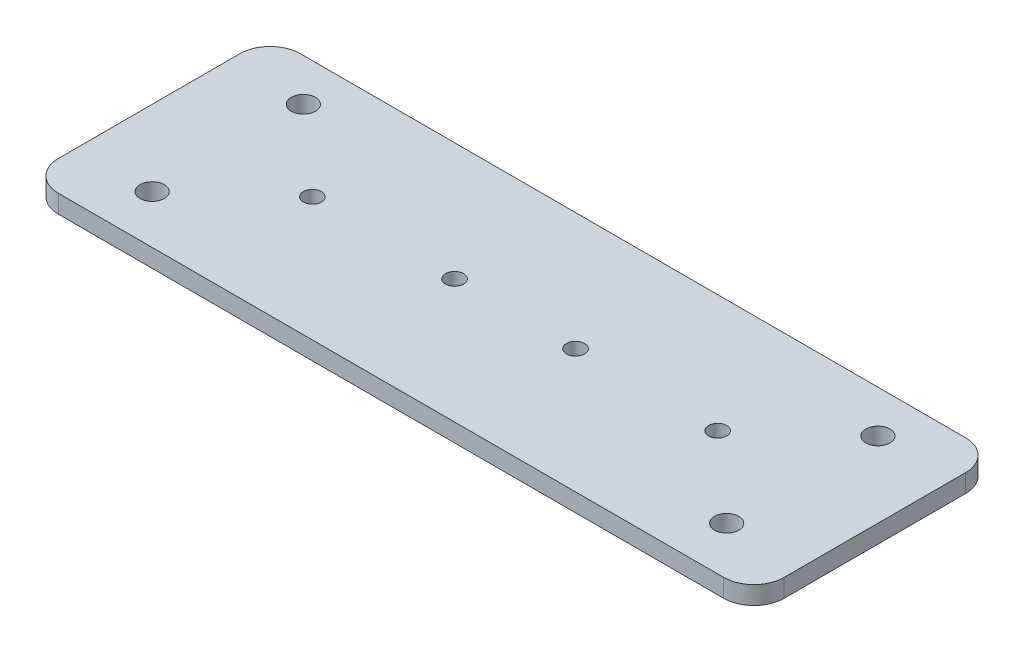
ISO-10303-21;
HEADER;
FILE_DESCRIPTION(('STEP AP214'),'2;1');
FILE_NAME('part.step','',(''),(''),'','','');
FILE_SCHEMA(('AUTOMOTIVE_DESIGN { 1 0 10303 214 1 1 1 1 }'));
ENDSEC;
DATA;
#1=APPLICATION_CONTEXT('core data for automotive mechanical design processes');
#2=APPLICATION_PROTOCOL_DEFINITION('international standard','automotive_design',2000,#1);
#3=PRODUCT_CONTEXT('',#1,'mechanical');
#4=PRODUCT('Part','Part','',(#3));
#5=PRODUCT_RELATED_PRODUCT_CATEGORY('part','',(#4));
#6=PRODUCT_DEFINITION_FORMATION('','',#4);
#7=PRODUCT_DEFINITION_CONTEXT('part definition',#1,'design');
#8=PRODUCT_DEFINITION('design','',#6,#7);
#9=PRODUCT_DEFINITION_SHAPE('','',#8);
#10=(LENGTH_UNIT() NAMED_UNIT(*) SI_UNIT(.MILLI.,.METRE.));
#11=(NAMED_UNIT(*) PLANE_ANGLE_UNIT() SI_UNIT($,.RADIAN.));
#12=(NAMED_UNIT(*) SI_UNIT($,.STERADIAN.) SOLID_ANGLE_UNIT());
#13=UNCERTAINTY_MEASURE_WITH_UNIT(LENGTH_MEASURE(1.E-05),#10,'distance_accuracy_value','');
#14=(GEOMETRIC_REPRESENTATION_CONTEXT(3) GLOBAL_UNCERTAINTY_ASSIGNED_CONTEXT((#13)) GLOBAL_UNIT_ASSIGNED_CONTEXT((#10,
#11,#12)) REPRESENTATION_CONTEXT('',''));
#15=CARTESIAN_POINT('',(0.,0.,0.));
#16=DIRECTION('',(0.,0.,1.));
#17=DIRECTION('',(1.,0.,0.));
#18=AXIS2_PLACEMENT_3D('',#15,#16,#17);
#19=CARTESIAN_POINT('',(0.,3.,0.));
#20=DIRECTION('',(0.,-1.,0.));
#21=DIRECTION('',(0.,0.,-1.));
#22=AXIS2_PLACEMENT_3D('',#19,#20,#21);
#23=PLANE('',#22);
#24=DIRECTION('',(0.,0.,1.));
#25=VECTOR('',#24,1.);
#26=CARTESIAN_POINT('',(-60.,3.,0.));
#27=LINE('',#26,#25);
#28=CARTESIAN_POINT('',(-60.,3.,-35.));
#29=VERTEX_POINT('',#28);
#30=CARTESIAN_POINT('',(-60.,3.,-5.));
#31=VERTEX_POINT('',#30);
#32=EDGE_CURVE('E143',#29,#31,#27,.T.);
#33=ORIENTED_EDGE('',*,*,#32,.T.);
#34=CARTESIAN_POINT('',(-55.,3.,-5.));
#35=DIRECTION('',(0.,-1.,0.));
#36=DIRECTION('',(0.,0.,-1.));
#37=AXIS2_PLACEMENT_3D('',#34,#35,#36);
#38=CIRCLE('',#37,5.);
#39=CARTESIAN_POINT('',(-55.,3.,0.));
#40=VERTEX_POINT('',#39);
#41=EDGE_CURVE('E157',#31,#40,#38,.F.);
#42=ORIENTED_EDGE('',*,*,#41,.T.);
#43=DIRECTION('',(1.,0.,0.));
#44=VECTOR('',#43,1.);
#45=CARTESIAN_POINT('',(-60.,3.,0.));
#46=LINE('',#45,#44);
#47=CARTESIAN_POINT('',(55.,3.,0.));
#48=VERTEX_POINT('',#47);
#49=EDGE_CURVE('E124',#40,#48,#46,.T.);
#50=ORIENTED_EDGE('',*,*,#49,.T.);
#51=CARTESIAN_POINT('',(55.,3.,-5.00000000000002));
#52=DIRECTION('',(0.,-1.,0.));
#53=DIRECTION('',(0.,0.,-1.));
#54=AXIS2_PLACEMENT_3D('',#51,#52,#53);
#55=CIRCLE('',#54,5.);
#56=CARTESIAN_POINT('',(60.,3.,-5.00000000000002));
#57=VERTEX_POINT('',#56);
#58=EDGE_CURVE('E153',#48,#57,#55,.F.);
#59=ORIENTED_EDGE('',*,*,#58,.T.);
#60=DIRECTION('',(0.,0.,-1.));
#61=VECTOR('',#60,1.);
#62=CARTESIAN_POINT('',(60.,3.,0.));
#63=LINE('',#62,#61);
#64=CARTESIAN_POINT('',(60.,3.,-35.));
#65=VERTEX_POINT('',#64);
#66=EDGE_CURVE('E166',#57,#65,#63,.T.);
#67=ORIENTED_EDGE('',*,*,#66,.T.);
#68=CARTESIAN_POINT('',(55.,3.,-35.));
#69=DIRECTION('',(0.,-1.,0.));
#70=DIRECTION('',(0.,0.,-1.));
#71=AXIS2_PLACEMENT_3D('',#68,#69,#70);
#72=CIRCLE('',#71,5.);
#73=CARTESIAN_POINT('',(55.,3.,-40.));
#74=VERTEX_POINT('',#73);
#75=EDGE_CURVE('E59',#65,#74,#72,.F.);
#76=ORIENTED_EDGE('',*,*,#75,.T.);
#77=DIRECTION('',(-1.,0.,0.));
#78=VECTOR('',#77,1.);
#79=CARTESIAN_POINT('',(-60.,3.,-40.));
#80=LINE('',#79,#78);
#81=CARTESIAN_POINT('',(-55.,3.,-40.));
#82=VERTEX_POINT('',#81);
#83=EDGE_CURVE('E144',#74,#82,#80,.T.);
#84=ORIENTED_EDGE('',*,*,#83,.T.);
#85=CARTESIAN_POINT('',(-55.,3.,-35.));
#86=DIRECTION('',(0.,-1.,0.));
#87=DIRECTION('',(0.,0.,-1.));
#88=AXIS2_PLACEMENT_3D('',#85,#86,#87);
#89=CIRCLE('',#88,5.);
#90=EDGE_CURVE('E155',#82,#29,#89,.F.);
#91=ORIENTED_EDGE('',*,*,#90,.T.);
#92=EDGE_LOOP('',(#33,#42,#50,#59,#67,#76,#84,#91));
#93=FACE_BOUND('',#92,.T.);
#94=CARTESIAN_POINT('',(10.,3.,-20.5));
#95=DIRECTION('',(0.,1.,0.));
#96=DIRECTION('',(0.,0.,1.));
#97=AXIS2_PLACEMENT_3D('',#94,#95,#96);
#98=CIRCLE('',#97,1.5);
#99=CARTESIAN_POINT('',(10.,3.,-19.));
#100=VERTEX_POINT('',#99);
#101=EDGE_CURVE('E138',#100,#100,#98,.T.);
#102=ORIENTED_EDGE('',*,*,#101,.F.);
#103=EDGE_LOOP('',(#102));
#104=FACE_BOUND('',#103,.T.);
#105=CARTESIAN_POINT('',(-10.,3.,-20.5));
#106=DIRECTION('',(0.,1.,0.));
#107=DIRECTION('',(0.,0.,1.));
#108=AXIS2_PLACEMENT_3D('',#105,#106,#107);
#109=CIRCLE('',#108,1.5);
#110=CARTESIAN_POINT('',(-10.,3.,-19.));
#111=VERTEX_POINT('',#110);
#112=EDGE_CURVE('E189',#111,#111,#109,.T.);
#113=ORIENTED_EDGE('',*,*,#112,.F.);
#114=EDGE_LOOP('',(#113));
#115=FACE_BOUND('',#114,.T.);
#116=CARTESIAN_POINT('',(-33.5,3.,-20.5));
#117=DIRECTION('',(0.,1.,0.));
#118=DIRECTION('',(0.,0.,1.));
#119=AXIS2_PLACEMENT_3D('',#116,#117,#118);
#120=CIRCLE('',#119,1.5);
#121=CARTESIAN_POINT('',(-33.5,3.,-19.));
#122=VERTEX_POINT('',#121);
#123=EDGE_CURVE('E195',#122,#122,#120,.T.);
#124=ORIENTED_EDGE('',*,*,#123,.F.);
#125=EDGE_LOOP('',(#124));
#126=FACE_BOUND('',#125,.T.);
#127=CARTESIAN_POINT('',(33.5,3.,-20.5));
#128=DIRECTION('',(0.,1.,0.));
#129=DIRECTION('',(0.,0.,1.));
#130=AXIS2_PLACEMENT_3D('',#127,#128,#129);
#131=CIRCLE('',#130,1.5);
#132=CARTESIAN_POINT('',(33.5,3.,-19.));
#133=VERTEX_POINT('',#132);
#134=EDGE_CURVE('E201',#133,#133,#131,.T.);
#135=ORIENTED_EDGE('',*,*,#134,.F.);
#136=EDGE_LOOP('',(#135));
#137=FACE_BOUND('',#136,.T.);
#138=CARTESIAN_POINT('',(-47.5,3.,-33.));
#139=DIRECTION('',(0.,1.,0.));
#140=DIRECTION('',(0.,0.,1.));
#141=AXIS2_PLACEMENT_3D('',#138,#139,#140);
#142=CIRCLE('',#141,2.);
#143=CARTESIAN_POINT('',(-47.5,3.,-31.));
#144=VERTEX_POINT('',#143);
#145=EDGE_CURVE('E207',#144,#144,#142,.T.);
#146=ORIENTED_EDGE('',*,*,#145,.F.);
#147=EDGE_LOOP('',(#146));
#148=FACE_BOUND('',#147,.T.);
#149=CARTESIAN_POINT('',(-47.5,3.,-8.));
#150=DIRECTION('',(0.,1.,0.));
#151=DIRECTION('',(0.,0.,1.));
#152=AXIS2_PLACEMENT_3D('',#149,#150,#151);
#153=CIRCLE('',#152,2.);
#154=CARTESIAN_POINT('',(-47.5,3.,-6.));
#155=VERTEX_POINT('',#154);
#156=EDGE_CURVE('E213',#155,#155,#153,.T.);
#157=ORIENTED_EDGE('',*,*,#156,.F.);
#158=EDGE_LOOP('',(#157));
#159=FACE_BOUND('',#158,.T.);
#160=CARTESIAN_POINT('',(47.5,3.,-33.));
#161=DIRECTION('',(0.,1.,0.));
#162=DIRECTION('',(0.,0.,1.));
#163=AXIS2_PLACEMENT_3D('',#160,#161,#162);
#164=CIRCLE('',#163,2.);
#165=CARTESIAN_POINT('',(47.5,3.,-31.));
#166=VERTEX_POINT('',#165);
#167=EDGE_CURVE('E219',#166,#166,#164,.T.);
#168=ORIENTED_EDGE('',*,*,#167,.F.);
#169=EDGE_LOOP('',(#168));
#170=FACE_BOUND('',#169,.T.);
#171=CARTESIAN_POINT('',(47.5,3.,-8.00000000000001));
#172=DIRECTION('',(0.,1.,0.));
#173=DIRECTION('',(0.,0.,1.));
#174=AXIS2_PLACEMENT_3D('',#171,#172,#173);
#175=CIRCLE('',#174,2.);
#176=CARTESIAN_POINT('',(47.5,3.,-6.00000000000001));
#177=VERTEX_POINT('',#176);
#178=EDGE_CURVE('E225',#177,#177,#175,.T.);
#179=ORIENTED_EDGE('',*,*,#178,.F.);
#180=EDGE_LOOP('',(#179));
#181=FACE_BOUND('',#180,.T.);
#182=ADVANCED_FACE('F37',(#93,#104,#115,#126,#137,#148,#159,#170,#181),#23,.F.);
#183=CARTESIAN_POINT('',(0.,0.,0.));
#184=DIRECTION('',(0.,-1.,0.));
#185=DIRECTION('',(0.,0.,-1.));
#186=AXIS2_PLACEMENT_3D('',#183,#184,#185);
#187=PLANE('',#186);
#188=CARTESIAN_POINT('',(47.5,0.,-33.));
#189=DIRECTION('',(0.,1.,0.));
#190=DIRECTION('',(0.,0.,1.));
#191=AXIS2_PLACEMENT_3D('',#188,#189,#190);
#192=CIRCLE('',#191,2.);
#193=CARTESIAN_POINT('',(47.5,0.,-31.));
#194=VERTEX_POINT('',#193);
#195=EDGE_CURVE('E222',#194,#194,#192,.T.);
#196=ORIENTED_EDGE('',*,*,#195,.T.);
#197=EDGE_LOOP('',(#196));
#198=FACE_BOUND('',#197,.T.);
#199=CARTESIAN_POINT('',(-47.5,0.,-33.));
#200=DIRECTION('',(0.,1.,0.));
#201=DIRECTION('',(0.,0.,1.));
#202=AXIS2_PLACEMENT_3D('',#199,#200,#201);
#203=CIRCLE('',#202,2.);
#204=CARTESIAN_POINT('',(-47.5,0.,-31.));
#205=VERTEX_POINT('',#204);
#206=EDGE_CURVE('E210',#205,#205,#203,.T.);
#207=ORIENTED_EDGE('',*,*,#206,.T.);
#208=EDGE_LOOP('',(#207));
#209=FACE_BOUND('',#208,.T.);
#210=CARTESIAN_POINT('',(-33.5,0.,-20.5));
#211=DIRECTION('',(0.,1.,0.));
#212=DIRECTION('',(0.,0.,1.));
#213=AXIS2_PLACEMENT_3D('',#210,#211,#212);
#214=CIRCLE('',#213,1.5);
#215=CARTESIAN_POINT('',(-33.5,0.,-19.));
#216=VERTEX_POINT('',#215);
#217=EDGE_CURVE('E198',#216,#216,#214,.T.);
#218=ORIENTED_EDGE('',*,*,#217,.T.);
#219=EDGE_LOOP('',(#218));
#220=FACE_BOUND('',#219,.T.);
#221=CARTESIAN_POINT('',(10.,0.,-20.5));
#222=DIRECTION('',(0.,1.,0.));
#223=DIRECTION('',(0.,0.,1.));
#224=AXIS2_PLACEMENT_3D('',#221,#222,#223);
#225=CIRCLE('',#224,1.5);
#226=CARTESIAN_POINT('',(10.,0.,-19.));
#227=VERTEX_POINT('',#226);
#228=EDGE_CURVE('E186',#227,#227,#225,.T.);
#229=ORIENTED_EDGE('',*,*,#228,.T.);
#230=EDGE_LOOP('',(#229));
#231=FACE_BOUND('',#230,.T.);
#232=DIRECTION('',(1.,0.,0.));
#233=VECTOR('',#232,1.);
#234=CARTESIAN_POINT('',(-60.,0.,0.));
#235=LINE('',#234,#233);
#236=CARTESIAN_POINT('',(-55.,0.,0.));
#237=VERTEX_POINT('',#236);
#238=CARTESIAN_POINT('',(55.,0.,0.));
#239=VERTEX_POINT('',#238);
#240=EDGE_CURVE('E121',#237,#239,#235,.T.);
#241=ORIENTED_EDGE('',*,*,#240,.F.);
#242=CARTESIAN_POINT('',(-55.,0.,-5.));
#243=DIRECTION('',(0.,-1.,0.));
#244=DIRECTION('',(0.,0.,-1.));
#245=AXIS2_PLACEMENT_3D('',#242,#243,#244);
#246=CIRCLE('',#245,5.);
#247=CARTESIAN_POINT('',(-60.,0.,-5.));
#248=VERTEX_POINT('',#247);
#249=EDGE_CURVE('E104',#237,#248,#246,.T.);
#250=ORIENTED_EDGE('',*,*,#249,.T.);
#251=DIRECTION('',(0.,0.,1.));
#252=VECTOR('',#251,1.);
#253=CARTESIAN_POINT('',(-60.,0.,0.));
#254=LINE('',#253,#252);
#255=CARTESIAN_POINT('',(-60.,0.,-35.));
#256=VERTEX_POINT('',#255);
#257=EDGE_CURVE('E133',#256,#248,#254,.T.);
#258=ORIENTED_EDGE('',*,*,#257,.F.);
#259=CARTESIAN_POINT('',(-55.,0.,-35.));
#260=DIRECTION('',(0.,-1.,0.));
#261=DIRECTION('',(0.,0.,-1.));
#262=AXIS2_PLACEMENT_3D('',#259,#260,#261);
#263=CIRCLE('',#262,5.);
#264=CARTESIAN_POINT('',(-55.,0.,-40.));
#265=VERTEX_POINT('',#264);
#266=EDGE_CURVE('E115',#256,#265,#263,.T.);
#267=ORIENTED_EDGE('',*,*,#266,.T.);
#268=DIRECTION('',(-1.,0.,0.));
#269=VECTOR('',#268,1.);
#270=CARTESIAN_POINT('',(-60.,0.,-40.));
#271=LINE('',#270,#269);
#272=CARTESIAN_POINT('',(55.,0.,-40.));
#273=VERTEX_POINT('',#272);
#274=EDGE_CURVE('E136',#273,#265,#271,.T.);
#275=ORIENTED_EDGE('',*,*,#274,.F.);
#276=CARTESIAN_POINT('',(55.,0.,-35.));
#277=DIRECTION('',(0.,-1.,0.));
#278=DIRECTION('',(0.,0.,-1.));
#279=AXIS2_PLACEMENT_3D('',#276,#277,#278);
#280=CIRCLE('',#279,5.);
#281=CARTESIAN_POINT('',(60.,0.,-35.));
#282=VERTEX_POINT('',#281);
#283=EDGE_CURVE('E125',#273,#282,#280,.T.);
#284=ORIENTED_EDGE('',*,*,#283,.T.);
#285=DIRECTION('',(0.,0.,-1.));
#286=VECTOR('',#285,1.);
#287=CARTESIAN_POINT('',(60.,0.,0.));
#288=LINE('',#287,#286);
#289=CARTESIAN_POINT('',(60.,0.,-5.00000000000002));
#290=VERTEX_POINT('',#289);
#291=EDGE_CURVE('E132',#290,#282,#288,.T.);
#292=ORIENTED_EDGE('',*,*,#291,.F.);
#293=CARTESIAN_POINT('',(55.,0.,-5.00000000000002));
#294=DIRECTION('',(0.,-1.,0.));
#295=DIRECTION('',(0.,0.,-1.));
#296=AXIS2_PLACEMENT_3D('',#293,#294,#295);
#297=CIRCLE('',#296,5.);
#298=EDGE_CURVE('E131',#290,#239,#297,.T.);
#299=ORIENTED_EDGE('',*,*,#298,.T.);
#300=EDGE_LOOP('',(#241,#250,#258,#267,#275,#284,#292,#299));
#301=FACE_BOUND('',#300,.T.);
#302=CARTESIAN_POINT('',(-10.,0.,-20.5));
#303=DIRECTION('',(0.,1.,0.));
#304=DIRECTION('',(0.,0.,1.));
#305=AXIS2_PLACEMENT_3D('',#302,#303,#304);
#306=CIRCLE('',#305,1.5);
#307=CARTESIAN_POINT('',(-10.,0.,-19.));
#308=VERTEX_POINT('',#307);
#309=EDGE_CURVE('E192',#308,#308,#306,.T.);
#310=ORIENTED_EDGE('',*,*,#309,.T.);
#311=EDGE_LOOP('',(#310));
#312=FACE_BOUND('',#311,.T.);
#313=CARTESIAN_POINT('',(33.5,0.,-20.5));
#314=DIRECTION('',(0.,1.,0.));
#315=DIRECTION('',(0.,0.,1.));
#316=AXIS2_PLACEMENT_3D('',#313,#314,#315);
#317=CIRCLE('',#316,1.5);
#318=CARTESIAN_POINT('',(33.5,0.,-19.));
#319=VERTEX_POINT('',#318);
#320=EDGE_CURVE('E204',#319,#319,#317,.T.);
#321=ORIENTED_EDGE('',*,*,#320,.T.);
#322=EDGE_LOOP('',(#321));
#323=FACE_BOUND('',#322,.T.);
#324=CARTESIAN_POINT('',(-47.5,0.,-8.));
#325=DIRECTION('',(0.,1.,0.));
#326=DIRECTION('',(0.,0.,1.));
#327=AXIS2_PLACEMENT_3D('',#324,#325,#326);
#328=CIRCLE('',#327,2.);
#329=CARTESIAN_POINT('',(-47.5,0.,-6.));
#330=VERTEX_POINT('',#329);
#331=EDGE_CURVE('E216',#330,#330,#328,.T.);
#332=ORIENTED_EDGE('',*,*,#331,.T.);
#333=EDGE_LOOP('',(#332));
#334=FACE_BOUND('',#333,.T.);
#335=CARTESIAN_POINT('',(47.5,0.,-8.00000000000001));
#336=DIRECTION('',(0.,1.,0.));
#337=DIRECTION('',(0.,0.,1.));
#338=AXIS2_PLACEMENT_3D('',#335,#336,#337);
#339=CIRCLE('',#338,2.);
#340=CARTESIAN_POINT('',(47.5,0.,-6.00000000000001));
#341=VERTEX_POINT('',#340);
#342=EDGE_CURVE('E228',#341,#341,#339,.T.);
#343=ORIENTED_EDGE('',*,*,#342,.T.);
#344=EDGE_LOOP('',(#343));
#345=FACE_BOUND('',#344,.T.);
#346=ADVANCED_FACE('F128',(#198,#209,#220,#231,#301,#312,#323,#334,#345),#187,.T.);
#347=CARTESIAN_POINT('',(-60.,3.,0.));
#348=DIRECTION('',(1.,0.,0.));
#349=DIRECTION('',(0.,0.,-1.));
#350=AXIS2_PLACEMENT_3D('',#347,#348,#349);
#351=PLANE('',#350);
#352=ORIENTED_EDGE('',*,*,#257,.T.);
#353=DIRECTION('',(0.,-1.,0.));
#354=VECTOR('',#353,1.);
#355=CARTESIAN_POINT('',(-60.,3.,-5.));
#356=LINE('',#355,#354);
#357=EDGE_CURVE('E109',#248,#31,#356,.F.);
#358=ORIENTED_EDGE('',*,*,#357,.T.);
#359=ORIENTED_EDGE('',*,*,#32,.F.);
#360=DIRECTION('',(0.,-1.,0.));
#361=VECTOR('',#360,1.);
#362=CARTESIAN_POINT('',(-60.,3.,-35.));
#363=LINE('',#362,#361);
#364=EDGE_CURVE('E114',#29,#256,#363,.T.);
#365=ORIENTED_EDGE('',*,*,#364,.T.);
#366=EDGE_LOOP('',(#352,#358,#359,#365));
#367=FACE_BOUND('',#366,.T.);
#368=ADVANCED_FACE('F182',(#367),#351,.F.);
#369=CARTESIAN_POINT('',(-60.,3.,0.));
#370=DIRECTION('',(0.,0.,-1.));
#371=DIRECTION('',(-1.,0.,0.));
#372=AXIS2_PLACEMENT_3D('',#369,#370,#371);
#373=PLANE('',#372);
#374=ORIENTED_EDGE('',*,*,#49,.F.);
#375=DIRECTION('',(0.,-1.,0.));
#376=VECTOR('',#375,1.);
#377=CARTESIAN_POINT('',(-55.,3.,0.));
#378=LINE('',#377,#376);
#379=EDGE_CURVE('E108',#40,#237,#378,.T.);
#380=ORIENTED_EDGE('',*,*,#379,.T.);
#381=ORIENTED_EDGE('',*,*,#240,.T.);
#382=DIRECTION('',(0.,-1.,0.));
#383=VECTOR('',#382,1.);
#384=CARTESIAN_POINT('',(55.,3.,0.));
#385=LINE('',#384,#383);
#386=EDGE_CURVE('E126',#239,#48,#385,.F.);
#387=ORIENTED_EDGE('',*,*,#386,.T.);
#388=EDGE_LOOP('',(#374,#380,#381,#387));
#389=FACE_BOUND('',#388,.T.);
#390=ADVANCED_FACE('F120',(#389),#373,.F.);
#391=CARTESIAN_POINT('',(60.,3.,0.));
#392=DIRECTION('',(-1.,0.,0.));
#393=DIRECTION('',(0.,0.,1.));
#394=AXIS2_PLACEMENT_3D('',#391,#392,#393);
#395=PLANE('',#394);
#396=ORIENTED_EDGE('',*,*,#66,.F.);
#397=DIRECTION('',(0.,-1.,0.));
#398=VECTOR('',#397,1.);
#399=CARTESIAN_POINT('',(60.,3.,-5.00000000000002));
#400=LINE('',#399,#398);
#401=EDGE_CURVE('E11',#57,#290,#400,.T.);
#402=ORIENTED_EDGE('',*,*,#401,.T.);
#403=ORIENTED_EDGE('',*,*,#291,.T.);
#404=DIRECTION('',(0.,-1.,0.));
#405=VECTOR('',#404,1.);
#406=CARTESIAN_POINT('',(60.,3.,-35.));
#407=LINE('',#406,#405);
#408=EDGE_CURVE('E45',#282,#65,#407,.F.);
#409=ORIENTED_EDGE('',*,*,#408,.T.);
#410=EDGE_LOOP('',(#396,#402,#403,#409));
#411=FACE_BOUND('',#410,.T.);
#412=ADVANCED_FACE('F165',(#411),#395,.F.);
#413=CARTESIAN_POINT('',(-60.,3.,-40.));
#414=DIRECTION('',(0.,0.,1.));
#415=DIRECTION('',(1.,0.,0.));
#416=AXIS2_PLACEMENT_3D('',#413,#414,#415);
#417=PLANE('',#416);
#418=ORIENTED_EDGE('',*,*,#274,.T.);
#419=DIRECTION('',(0.,-1.,0.));
#420=VECTOR('',#419,1.);
#421=CARTESIAN_POINT('',(-55.,3.,-40.));
#422=LINE('',#421,#420);
#423=EDGE_CURVE('E52',#265,#82,#422,.F.);
#424=ORIENTED_EDGE('',*,*,#423,.T.);
#425=ORIENTED_EDGE('',*,*,#83,.F.);
#426=DIRECTION('',(0.,-1.,0.));
#427=VECTOR('',#426,1.);
#428=CARTESIAN_POINT('',(55.,3.,-40.));
#429=LINE('',#428,#427);
#430=EDGE_CURVE('E159',#74,#273,#429,.T.);
#431=ORIENTED_EDGE('',*,*,#430,.T.);
#432=EDGE_LOOP('',(#418,#424,#425,#431));
#433=FACE_BOUND('',#432,.T.);
#434=ADVANCED_FACE('F175',(#433),#417,.F.);
#435=CARTESIAN_POINT('',(10.,3.,-20.5));
#436=DIRECTION('',(0.,-1.,0.));
#437=DIRECTION('',(0.,0.,-1.));
#438=AXIS2_PLACEMENT_3D('',#435,#436,#437);
#439=CYLINDRICAL_SURFACE('',#438,1.5);
#440=ORIENTED_EDGE('',*,*,#101,.T.);
#441=EDGE_LOOP('',(#440));
#442=FACE_BOUND('',#441,.T.);
#443=ORIENTED_EDGE('',*,*,#228,.F.);
#444=EDGE_LOOP('',(#443));
#445=FACE_BOUND('',#444,.T.);
#446=ADVANCED_FACE('F245',(#442,#445),#439,.F.);
#447=CARTESIAN_POINT('',(-10.,3.,-20.5));
#448=DIRECTION('',(0.,-1.,0.));
#449=DIRECTION('',(0.,0.,-1.));
#450=AXIS2_PLACEMENT_3D('',#447,#448,#449);
#451=CYLINDRICAL_SURFACE('',#450,1.5);
#452=ORIENTED_EDGE('',*,*,#112,.T.);
#453=EDGE_LOOP('',(#452));
#454=FACE_BOUND('',#453,.T.);
#455=ORIENTED_EDGE('',*,*,#309,.F.);
#456=EDGE_LOOP('',(#455));
#457=FACE_BOUND('',#456,.T.);
#458=ADVANCED_FACE('F377',(#454,#457),#451,.F.);
#459=CARTESIAN_POINT('',(-33.5,3.,-20.5));
#460=DIRECTION('',(0.,-1.,0.));
#461=DIRECTION('',(0.,0.,-1.));
#462=AXIS2_PLACEMENT_3D('',#459,#460,#461);
#463=CYLINDRICAL_SURFACE('',#462,1.5);
#464=ORIENTED_EDGE('',*,*,#123,.T.);
#465=EDGE_LOOP('',(#464));
#466=FACE_BOUND('',#465,.T.);
#467=ORIENTED_EDGE('',*,*,#217,.F.);
#468=EDGE_LOOP('',(#467));
#469=FACE_BOUND('',#468,.T.);
#470=ADVANCED_FACE('F367',(#466,#469),#463,.F.);
#471=CARTESIAN_POINT('',(33.5,3.,-20.5));
#472=DIRECTION('',(0.,-1.,0.));
#473=DIRECTION('',(0.,0.,-1.));
#474=AXIS2_PLACEMENT_3D('',#471,#472,#473);
#475=CYLINDRICAL_SURFACE('',#474,1.5);
#476=ORIENTED_EDGE('',*,*,#134,.T.);
#477=EDGE_LOOP('',(#476));
#478=FACE_BOUND('',#477,.T.);
#479=ORIENTED_EDGE('',*,*,#320,.F.);
#480=EDGE_LOOP('',(#479));
#481=FACE_BOUND('',#480,.T.);
#482=ADVANCED_FACE('F357',(#478,#481),#475,.F.);
#483=CARTESIAN_POINT('',(-47.5,3.,-33.));
#484=DIRECTION('',(0.,-1.,0.));
#485=DIRECTION('',(0.,0.,-1.));
#486=AXIS2_PLACEMENT_3D('',#483,#484,#485);
#487=CYLINDRICAL_SURFACE('',#486,2.);
#488=ORIENTED_EDGE('',*,*,#145,.T.);
#489=EDGE_LOOP('',(#488));
#490=FACE_BOUND('',#489,.T.);
#491=ORIENTED_EDGE('',*,*,#206,.F.);
#492=EDGE_LOOP('',(#491));
#493=FACE_BOUND('',#492,.T.);
#494=ADVANCED_FACE('F347',(#490,#493),#487,.F.);
#495=CARTESIAN_POINT('',(-47.5,3.,-8.));
#496=DIRECTION('',(0.,-1.,0.));
#497=DIRECTION('',(0.,0.,-1.));
#498=AXIS2_PLACEMENT_3D('',#495,#496,#497);
#499=CYLINDRICAL_SURFACE('',#498,2.);
#500=ORIENTED_EDGE('',*,*,#156,.T.);
#501=EDGE_LOOP('',(#500));
#502=FACE_BOUND('',#501,.T.);
#503=ORIENTED_EDGE('',*,*,#331,.F.);
#504=EDGE_LOOP('',(#503));
#505=FACE_BOUND('',#504,.T.);
#506=ADVANCED_FACE('F337',(#502,#505),#499,.F.);
#507=CARTESIAN_POINT('',(47.5,3.,-33.));
#508=DIRECTION('',(0.,-1.,0.));
#509=DIRECTION('',(0.,0.,-1.));
#510=AXIS2_PLACEMENT_3D('',#507,#508,#509);
#511=CYLINDRICAL_SURFACE('',#510,2.);
#512=ORIENTED_EDGE('',*,*,#167,.T.);
#513=EDGE_LOOP('',(#512));
#514=FACE_BOUND('',#513,.T.);
#515=ORIENTED_EDGE('',*,*,#195,.F.);
#516=EDGE_LOOP('',(#515));
#517=FACE_BOUND('',#516,.T.);
#518=ADVANCED_FACE('F328',(#514,#517),#511,.F.);
#519=CARTESIAN_POINT('',(47.5,3.,-8.00000000000001));
#520=DIRECTION('',(0.,-1.,0.));
#521=DIRECTION('',(0.,0.,-1.));
#522=AXIS2_PLACEMENT_3D('',#519,#520,#521);
#523=CYLINDRICAL_SURFACE('',#522,2.);
#524=ORIENTED_EDGE('',*,*,#178,.T.);
#525=EDGE_LOOP('',(#524));
#526=FACE_BOUND('',#525,.T.);
#527=ORIENTED_EDGE('',*,*,#342,.F.);
#528=EDGE_LOOP('',(#527));
#529=FACE_BOUND('',#528,.T.);
#530=ADVANCED_FACE('F234',(#526,#529),#523,.F.);
#531=CARTESIAN_POINT('',(-55.,3.,-5.));
#532=DIRECTION('',(0.,-1.,0.));
#533=DIRECTION('',(0.,0.,-1.));
#534=AXIS2_PLACEMENT_3D('',#531,#532,#533);
#535=CYLINDRICAL_SURFACE('',#534,5.);
#536=ORIENTED_EDGE('',*,*,#41,.F.);
#537=ORIENTED_EDGE('',*,*,#357,.F.);
#538=ORIENTED_EDGE('',*,*,#249,.F.);
#539=ORIENTED_EDGE('',*,*,#379,.F.);
#540=EDGE_LOOP('',(#536,#537,#538,#539));
#541=FACE_BOUND('',#540,.T.);
#542=ADVANCED_FACE('F107',(#541),#535,.T.);
#543=CARTESIAN_POINT('',(-55.,3.,-35.));
#544=DIRECTION('',(0.,-1.,0.));
#545=DIRECTION('',(0.,0.,-1.));
#546=AXIS2_PLACEMENT_3D('',#543,#544,#545);
#547=CYLINDRICAL_SURFACE('',#546,5.);
#548=ORIENTED_EDGE('',*,*,#90,.F.);
#549=ORIENTED_EDGE('',*,*,#423,.F.);
#550=ORIENTED_EDGE('',*,*,#266,.F.);
#551=ORIENTED_EDGE('',*,*,#364,.F.);
#552=EDGE_LOOP('',(#548,#549,#550,#551));
#553=FACE_BOUND('',#552,.T.);
#554=ADVANCED_FACE('F179',(#553),#547,.T.);
#555=CARTESIAN_POINT('',(55.,3.,-5.00000000000002));
#556=DIRECTION('',(0.,-1.,0.));
#557=DIRECTION('',(0.,0.,-1.));
#558=AXIS2_PLACEMENT_3D('',#555,#556,#557);
#559=CYLINDRICAL_SURFACE('',#558,5.);
#560=ORIENTED_EDGE('',*,*,#58,.F.);
#561=ORIENTED_EDGE('',*,*,#386,.F.);
#562=ORIENTED_EDGE('',*,*,#298,.F.);
#563=ORIENTED_EDGE('',*,*,#401,.F.);
#564=EDGE_LOOP('',(#560,#561,#562,#563));
#565=FACE_BOUND('',#564,.T.);
#566=ADVANCED_FACE('F259',(#565),#559,.T.);
#567=CARTESIAN_POINT('',(55.,3.,-35.));
#568=DIRECTION('',(0.,-1.,0.));
#569=DIRECTION('',(0.,0.,-1.));
#570=AXIS2_PLACEMENT_3D('',#567,#568,#569);
#571=CYLINDRICAL_SURFACE('',#570,5.);
#572=ORIENTED_EDGE('',*,*,#75,.F.);
#573=ORIENTED_EDGE('',*,*,#408,.F.);
#574=ORIENTED_EDGE('',*,*,#283,.F.);
#575=ORIENTED_EDGE('',*,*,#430,.F.);
#576=EDGE_LOOP('',(#572,#573,#574,#575));
#577=FACE_BOUND('',#576,.T.);
#578=ADVANCED_FACE('F39',(#577),#571,.T.);
#579=CLOSED_SHELL('',(#182,#346,#368,#390,#412,#434,#446,#458,#470,#482,#494,#506,#518,#530,
#542,#554,#566,#578));
#580=MANIFOLD_SOLID_BREP('B2',#579);
#581=ADVANCED_BREP_SHAPE_REPRESENTATION('',(#18,#580),#14);
#582=SHAPE_DEFINITION_REPRESENTATION(#9,#581);
ENDSEC;
END-ISO-10303-21;
